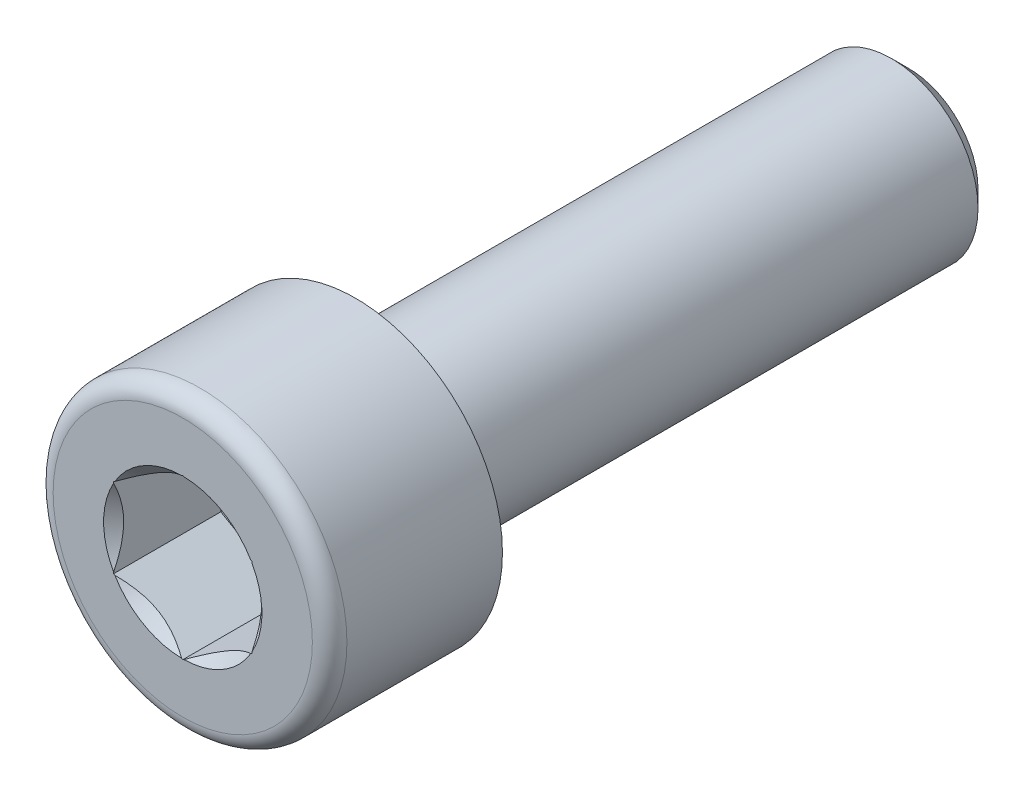
ISO-10303-21;
HEADER;
FILE_DESCRIPTION(('STEP AP214'),'2;1');
FILE_NAME('part.step','',(''),(''),'','','');
FILE_SCHEMA(('AUTOMOTIVE_DESIGN { 1 0 10303 214 1 1 1 1 }'));
ENDSEC;
DATA;
#1=APPLICATION_CONTEXT('core data for automotive mechanical design processes');
#2=APPLICATION_PROTOCOL_DEFINITION('international standard','automotive_design',2000,#1);
#3=PRODUCT_CONTEXT('',#1,'mechanical');
#4=PRODUCT('Part','Part','',(#3));
#5=PRODUCT_RELATED_PRODUCT_CATEGORY('part','',(#4));
#6=PRODUCT_DEFINITION_FORMATION('','',#4);
#7=PRODUCT_DEFINITION_CONTEXT('part definition',#1,'design');
#8=PRODUCT_DEFINITION('design','',#6,#7);
#9=PRODUCT_DEFINITION_SHAPE('','',#8);
#10=(LENGTH_UNIT() NAMED_UNIT(*) SI_UNIT(.MILLI.,.METRE.));
#11=(NAMED_UNIT(*) PLANE_ANGLE_UNIT() SI_UNIT($,.RADIAN.));
#12=(NAMED_UNIT(*) SI_UNIT($,.STERADIAN.) SOLID_ANGLE_UNIT());
#13=UNCERTAINTY_MEASURE_WITH_UNIT(LENGTH_MEASURE(1.E-05),#10,'distance_accuracy_value','');
#14=(GEOMETRIC_REPRESENTATION_CONTEXT(3) GLOBAL_UNCERTAINTY_ASSIGNED_CONTEXT((#13)) GLOBAL_UNIT_ASSIGNED_CONTEXT((#10,
#11,#12)) REPRESENTATION_CONTEXT('',''));
#15=CARTESIAN_POINT('',(0.,0.,0.));
#16=DIRECTION('',(0.,0.,1.));
#17=DIRECTION('',(1.,0.,0.));
#18=AXIS2_PLACEMENT_3D('',#15,#16,#17);
#19=CARTESIAN_POINT('',(0.,-12.,7.9));
#20=DIRECTION('',(0.,0.,-1.));
#21=DIRECTION('',(-1.,0.,0.));
#22=AXIS2_PLACEMENT_3D('',#19,#20,#21);
#23=PLANE('',#22);
#24=DIRECTION('',(0.,1.,0.));
#25=VECTOR('',#24,1.);
#26=CARTESIAN_POINT('',(2.,-12.,7.9));
#27=LINE('',#26,#25);
#28=CARTESIAN_POINT('',(2.,-10.8452994616207,7.9));
#29=VERTEX_POINT('',#28);
#30=CARTESIAN_POINT('',(1.99999999997658,-12.,7.90000000003605));
#31=VERTEX_POINT('',#30);
#32=EDGE_CURVE('E141',#29,#31,#27,.F.);
#33=ORIENTED_EDGE('',*,*,#32,.F.);
#34=DIRECTION('',(0.866025403784449,-0.499999999999982,0.));
#35=VECTOR('',#34,1.);
#36=CARTESIAN_POINT('',(1.,-10.2679491924311,7.9));
#37=LINE('',#36,#35);
#38=CARTESIAN_POINT('',(0.99999999998828,-10.2679491924514,7.90000000003605));
#39=VERTEX_POINT('',#38);
#40=EDGE_CURVE('E164',#39,#29,#37,.T.);
#41=ORIENTED_EDGE('',*,*,#40,.F.);
#42=CARTESIAN_POINT('',(0.,-12.,7.90000000007209));
#43=DIRECTION('',(0.,0.,1.));
#44=DIRECTION('',(1.,0.,0.));
#45=AXIS2_PLACEMENT_3D('',#42,#43,#44);
#46=CIRCLE('',#45,1.99999999995316);
#47=EDGE_CURVE('E171',#39,#31,#46,.F.);
#48=ORIENTED_EDGE('',*,*,#47,.T.);
#49=EDGE_LOOP('',(#33,#41,#48));
#50=FACE_BOUND('',#49,.T.);
#51=ADVANCED_FACE('F16',(#50),#23,.F.);
#52=CARTESIAN_POINT('',(0.,-12.,7.9));
#53=DIRECTION('',(0.,0.,-1.));
#54=DIRECTION('',(-1.,0.,0.));
#55=AXIS2_PLACEMENT_3D('',#52,#53,#54);
#56=PLANE('',#55);
#57=DIRECTION('',(-0.866025403784449,-0.499999999999982,0.));
#58=VECTOR('',#57,1.);
#59=CARTESIAN_POINT('',(2.,-13.1547005383793,7.9));
#60=LINE('',#59,#58);
#61=CARTESIAN_POINT('',(2.,-13.1547005383793,7.9));
#62=VERTEX_POINT('',#61);
#63=CARTESIAN_POINT('',(0.999999999988285,-13.7320508075486,7.90000000003605));
#64=VERTEX_POINT('',#63);
#65=EDGE_CURVE('E576',#62,#64,#60,.T.);
#66=ORIENTED_EDGE('',*,*,#65,.F.);
#67=DIRECTION('',(0.,1.,0.));
#68=VECTOR('',#67,1.);
#69=CARTESIAN_POINT('',(2.,-12.,7.9));
#70=LINE('',#69,#68);
#71=EDGE_CURVE('E581',#31,#62,#70,.F.);
#72=ORIENTED_EDGE('',*,*,#71,.F.);
#73=CARTESIAN_POINT('',(0.,-12.,7.90000000007209));
#74=DIRECTION('',(0.,0.,1.));
#75=DIRECTION('',(1.,0.,0.));
#76=AXIS2_PLACEMENT_3D('',#73,#74,#75);
#77=CIRCLE('',#76,1.99999999995316);
#78=EDGE_CURVE('E178',#31,#64,#77,.F.);
#79=ORIENTED_EDGE('',*,*,#78,.T.);
#80=EDGE_LOOP('',(#66,#72,#79));
#81=FACE_BOUND('',#80,.T.);
#82=ADVANCED_FACE('F592',(#81),#56,.F.);
#83=CARTESIAN_POINT('',(0.,-12.,7.9));
#84=DIRECTION('',(0.,0.,-1.));
#85=DIRECTION('',(-1.,0.,0.));
#86=AXIS2_PLACEMENT_3D('',#83,#84,#85);
#87=PLANE('',#86);
#88=DIRECTION('',(0.866025403784449,0.499999999999982,0.));
#89=VECTOR('',#88,1.);
#90=CARTESIAN_POINT('',(-2.,-10.8452994616207,7.9));
#91=LINE('',#90,#89);
#92=CARTESIAN_POINT('',(-2.,-10.8452994616207,7.9));
#93=VERTEX_POINT('',#92);
#94=CARTESIAN_POINT('',(-0.999999999988285,-10.2679491924514,7.90000000003605));
#95=VERTEX_POINT('',#94);
#96=EDGE_CURVE('E179',#93,#95,#91,.T.);
#97=ORIENTED_EDGE('',*,*,#96,.F.);
#98=DIRECTION('',(0.,1.,0.));
#99=VECTOR('',#98,1.);
#100=CARTESIAN_POINT('',(-2.,-12.,7.9));
#101=LINE('',#100,#99);
#102=CARTESIAN_POINT('',(-1.99999999997658,-12.,7.90000000003605));
#103=VERTEX_POINT('',#102);
#104=EDGE_CURVE('E183',#103,#93,#101,.T.);
#105=ORIENTED_EDGE('',*,*,#104,.F.);
#106=CARTESIAN_POINT('',(0.,-12.,7.90000000007209));
#107=DIRECTION('',(0.,0.,1.));
#108=DIRECTION('',(1.,0.,0.));
#109=AXIS2_PLACEMENT_3D('',#106,#107,#108);
#110=CIRCLE('',#109,1.99999999995316);
#111=EDGE_CURVE('E157',#103,#95,#110,.F.);
#112=ORIENTED_EDGE('',*,*,#111,.T.);
#113=EDGE_LOOP('',(#97,#105,#112));
#114=FACE_BOUND('',#113,.T.);
#115=ADVANCED_FACE('F736',(#114),#87,.F.);
#116=CARTESIAN_POINT('',(0.,-12.,7.90000000000646));
#117=DIRECTION('',(0.,0.,1.));
#118=DIRECTION('',(1.,0.,0.));
#119=AXIS2_PLACEMENT_3D('',#116,#117,#118);
#120=CONICAL_SURFACE('',#119,1.99999999983947,1.04719755116573);
#121=CARTESIAN_POINT('',(0.,-12.,7.90000000007209));
#122=DIRECTION('',(0.,0.,1.));
#123=DIRECTION('',(1.,0.,0.));
#124=AXIS2_PLACEMENT_3D('',#121,#122,#123);
#125=CIRCLE('',#124,1.99999999995316);
#126=CARTESIAN_POINT('',(-0.999999999988287,-13.7320508075486,7.90000000003605));
#127=VERTEX_POINT('',#126);
#128=EDGE_CURVE('E181',#64,#127,#125,.F.);
#129=ORIENTED_EDGE('',*,*,#128,.F.);
#130=ORIENTED_EDGE('',*,*,#78,.F.);
#131=ORIENTED_EDGE('',*,*,#47,.F.);
#132=CARTESIAN_POINT('',(0.,-12.,7.90000000007209));
#133=DIRECTION('',(0.,0.,1.));
#134=DIRECTION('',(1.,0.,0.));
#135=AXIS2_PLACEMENT_3D('',#132,#133,#134);
#136=CIRCLE('',#135,1.99999999995316);
#137=EDGE_CURVE('E147',#95,#39,#136,.F.);
#138=ORIENTED_EDGE('',*,*,#137,.F.);
#139=ORIENTED_EDGE('',*,*,#111,.F.);
#140=CARTESIAN_POINT('',(0.,-12.,7.90000000007209));
#141=DIRECTION('',(0.,0.,1.));
#142=DIRECTION('',(1.,0.,0.));
#143=AXIS2_PLACEMENT_3D('',#140,#141,#142);
#144=CIRCLE('',#143,1.99999999995316);
#145=EDGE_CURVE('E427',#103,#127,#144,.T.);
#146=ORIENTED_EDGE('',*,*,#145,.T.);
#147=EDGE_LOOP('',(#129,#130,#131,#138,#139,#146));
#148=FACE_BOUND('',#147,.T.);
#149=CARTESIAN_POINT('',(0.,-12.0000000000005,6.74529946167013));
#150=VERTEX_POINT('',#149);
#151=VERTEX_LOOP('',#150);
#152=FACE_BOUND('',#151,.T.);
#153=ADVANCED_FACE('F175',(#148,#152),#120,.F.);
#154=CARTESIAN_POINT('',(0.,-12.,7.9));
#155=DIRECTION('',(0.,0.,-1.));
#156=DIRECTION('',(-1.,0.,0.));
#157=AXIS2_PLACEMENT_3D('',#154,#155,#156);
#158=PLANE('',#157);
#159=DIRECTION('',(0.,1.,0.));
#160=VECTOR('',#159,1.);
#161=CARTESIAN_POINT('',(-2.,-13.1547005383793,7.9));
#162=LINE('',#161,#160);
#163=CARTESIAN_POINT('',(-1.99999999999999,-13.1547005383793,7.9));
#164=VERTEX_POINT('',#163);
#165=EDGE_CURVE('E555',#103,#164,#162,.F.);
#166=ORIENTED_EDGE('',*,*,#165,.T.);
#167=DIRECTION('',(-0.866025403784449,0.499999999999982,0.));
#168=VECTOR('',#167,1.);
#169=CARTESIAN_POINT('',(-1.,-13.7320508075689,7.9));
#170=LINE('',#169,#168);
#171=EDGE_CURVE('E156',#127,#164,#170,.T.);
#172=ORIENTED_EDGE('',*,*,#171,.F.);
#173=ORIENTED_EDGE('',*,*,#145,.F.);
#174=EDGE_LOOP('',(#166,#172,#173));
#175=FACE_BOUND('',#174,.T.);
#176=ADVANCED_FACE('F601',(#175),#158,.F.);
#177=CARTESIAN_POINT('',(-2.,-13.1547005383793,7.9));
#178=DIRECTION('',(-1.,0.,0.));
#179=DIRECTION('',(0.,0.,1.));
#180=AXIS2_PLACEMENT_3D('',#177,#178,#179);
#181=PLANE('',#180);
#182=DIRECTION('',(0.,1.,0.));
#183=VECTOR('',#182,1.);
#184=CARTESIAN_POINT('',(-2.,-13.1547005383793,11.));
#185=LINE('',#184,#183);
#186=CARTESIAN_POINT('',(-1.99999999999998,-13.1547005383793,11.));
#187=VERTEX_POINT('',#186);
#188=CARTESIAN_POINT('',(-2.,-13.1153923076755,11.0000000000121));
#189=VERTEX_POINT('',#188);
#190=EDGE_CURVE('E426',#187,#189,#185,.T.);
#191=ORIENTED_EDGE('',*,*,#190,.F.);
#192=DIRECTION('',(0.,0.,1.));
#193=VECTOR('',#192,1.);
#194=CARTESIAN_POINT('',(-1.99999999999998,-13.1547005383793,7.9));
#195=LINE('',#194,#193);
#196=EDGE_CURVE('E544',#187,#164,#195,.F.);
#197=ORIENTED_EDGE('',*,*,#196,.T.);
#198=ORIENTED_EDGE('',*,*,#165,.F.);
#199=ORIENTED_EDGE('',*,*,#104,.T.);
#200=DIRECTION('',(0.,0.,1.));
#201=VECTOR('',#200,1.);
#202=CARTESIAN_POINT('',(-2.,-10.8452994616207,7.9));
#203=LINE('',#202,#201);
#204=CARTESIAN_POINT('',(-2.,-10.8452994616207,11.));
#205=VERTEX_POINT('',#204);
#206=EDGE_CURVE('E519',#93,#205,#203,.T.);
#207=ORIENTED_EDGE('',*,*,#206,.T.);
#208=DIRECTION('',(0.,1.,0.));
#209=VECTOR('',#208,1.);
#210=CARTESIAN_POINT('',(-2.,-13.1547005383793,11.));
#211=LINE('',#210,#209);
#212=CARTESIAN_POINT('',(-2.,-10.8846076923168,11.0000000000158));
#213=VERTEX_POINT('',#212);
#214=EDGE_CURVE('E558',#213,#205,#211,.T.);
#215=ORIENTED_EDGE('',*,*,#214,.F.);
#216=CARTESIAN_POINT('',(-2.,-13.1153923076661,11.0000000000075));
#217=CARTESIAN_POINT('',(-2.,-13.0387518757268,10.9626981445033));
#218=CARTESIAN_POINT('',(-2.,-12.9608599655105,10.9276654504736));
#219=CARTESIAN_POINT('',(-2.,-12.802128485581,10.8636189988048));
#220=CARTESIAN_POINT('',(-2.,-12.7212742913114,10.8346417974975));
#221=CARTESIAN_POINT('',(-2.,-12.5573995809352,10.784763712111));
#222=CARTESIAN_POINT('',(-2.,-12.4743889232887,10.7638312669518));
#223=CARTESIAN_POINT('',(-2.,-12.3066654533863,10.73171111632));
#224=CARTESIAN_POINT('',(-2.,-12.2219582318571,10.7204955196276));
#225=CARTESIAN_POINT('',(-2.,-12.1141427002297,10.7131239639143));
#226=CARTESIAN_POINT('',(-2.,-12.0913253973917,10.711953788984));
#227=CARTESIAN_POINT('',(-2.,-12.0456731167431,10.7103915974494));
#228=CARTESIAN_POINT('',(-2.,-12.0228381501097,10.7099992599771));
#229=CARTESIAN_POINT('',(-2.,-11.9392967625186,10.7100019669893));
#230=CARTESIAN_POINT('',(-2.,-11.8785710343111,10.7127809606342));
#231=CARTESIAN_POINT('',(-2.,-11.7575935247527,10.7237319807046));
#232=CARTESIAN_POINT('',(-2.,-11.6973421099882,10.7319078297067));
#233=CARTESIAN_POINT('',(-2.,-11.5174279195867,10.7640118546901));
#234=CARTESIAN_POINT('',(-2.,-11.3990735407787,10.7955114745661));
#235=CARTESIAN_POINT('',(-2.,-11.2148777068762,10.8576016114019));
#236=CARTESIAN_POINT('',(-2.,-11.1472693866304,10.8833439083316));
#237=CARTESIAN_POINT('',(-2.,-11.0143847648612,10.938873072445));
#238=CARTESIAN_POINT('',(-2.,-10.9490937287137,10.9686244614789));
#239=CARTESIAN_POINT('',(-2.,-10.8846076923339,11.0000000000075));
#240=B_SPLINE_CURVE_WITH_KNOTS('',3,(#216,#217,#218,#219,#220,#221,#222,#223,#224,#225,#226,
#227,#228,#229,#230,#231,#232,#233,#234,#235,#236,#237,#238,#239),.UNSPECIFIED.,.F.,.F.,(4,2,2,
2,2,2,2,2,2,2,2,4),(0.,0.255872334413266,0.513247357952124,0.769602085043043,1.02521851074913,
1.09375136973442,1.16225595213962,1.34433943588656,1.52655202741286,1.89236369423401,
2.10928491887019,2.32439915819559),.UNSPECIFIED.);
#241=EDGE_CURVE('E421',#189,#213,#240,.T.);
#242=ORIENTED_EDGE('',*,*,#241,.F.);
#243=EDGE_LOOP('',(#191,#197,#198,#199,#207,#215,#242));
#244=FACE_BOUND('',#243,.T.);
#245=ADVANCED_FACE('F411',(#244),#181,.F.);
#246=CARTESIAN_POINT('',(0.,-14.3094010767585,7.9));
#247=DIRECTION('',(-0.5,-0.866025403784439,0.));
#248=DIRECTION('',(0.866025403784439,-0.5,0.));
#249=AXIS2_PLACEMENT_3D('',#246,#247,#248);
#250=PLANE('',#249);
#251=DIRECTION('',(0.,0.,1.));
#252=VECTOR('',#251,1.);
#253=CARTESIAN_POINT('',(0.,-14.3094010767585,7.9));
#254=LINE('',#253,#252);
#255=CARTESIAN_POINT('',(0.,-14.3094010767585,11.));
#256=VERTEX_POINT('',#255);
#257=CARTESIAN_POINT('',(0.,-14.3094010767585,7.9));
#258=VERTEX_POINT('',#257);
#259=EDGE_CURVE('E499',#256,#258,#254,.F.);
#260=ORIENTED_EDGE('',*,*,#259,.T.);
#261=DIRECTION('',(-0.866025403784448,0.499999999999983,0.));
#262=VECTOR('',#261,1.);
#263=CARTESIAN_POINT('',(0.,-14.3094010767585,7.9));
#264=LINE('',#263,#262);
#265=EDGE_CURVE('E531',#258,#127,#264,.T.);
#266=ORIENTED_EDGE('',*,*,#265,.T.);
#267=ORIENTED_EDGE('',*,*,#171,.T.);
#268=ORIENTED_EDGE('',*,*,#196,.F.);
#269=DIRECTION('',(0.866025403784439,-0.5,0.));
#270=VECTOR('',#269,1.);
#271=CARTESIAN_POINT('',(0.,-14.3094010767585,11.));
#272=LINE('',#271,#270);
#273=CARTESIAN_POINT('',(-1.96595807363939,-13.1743546537273,11.0000000000158));
#274=VERTEX_POINT('',#273);
#275=EDGE_CURVE('E420',#274,#187,#272,.F.);
#276=ORIENTED_EDGE('',*,*,#275,.F.);
#277=CARTESIAN_POINT('',(-0.0340419263753788,-14.2897469614019,11.0000000000075));
#278=CARTESIAN_POINT('',(-0.100414487391851,-14.2514267454323,10.9626981445033));
#279=CARTESIAN_POINT('',(-0.167870860388495,-14.2124807903241,10.9276654504736));
#280=CARTESIAN_POINT('',(-0.305336354387733,-14.1331150503594,10.8636189988048));
#281=CARTESIAN_POINT('',(-0.375358140627674,-14.0926879532246,10.8346417974975));
#282=CARTESIAN_POINT('',(-0.517277802851353,-14.0107505980365,10.784763712111));
#283=CARTESIAN_POINT('',(-0.589167141157997,-13.9692452692132,10.7638312669518));
#284=CARTESIAN_POINT('',(-0.734419926904412,-13.885383534262,10.73171111632));
#285=CARTESIAN_POINT('',(-0.80777853263264,-13.8430299234974,10.7204955196276));
#286=CARTESIAN_POINT('',(-0.901149521944497,-13.7891221576837,10.7131239639143));
#287=CARTESIAN_POINT('',(-0.920909885848088,-13.7777135062647,10.711953788984));
#288=CARTESIAN_POINT('',(-0.960445920630417,-13.7548873659405,10.7103915974494));
#289=CARTESIAN_POINT('',(-0.980221581829553,-13.7434698826237,10.7099992599771));
#290=CARTESIAN_POINT('',(-1.05257054575086,-13.7016991888282,10.7100019669893));
#291=CARTESIAN_POINT('',(-1.1051605690418,-13.6713363247245,10.7127809606342));
#292=CARTESIAN_POINT('',(-1.20993016560602,-13.6108475699452,10.7237319807046));
#293=CARTESIAN_POINT('',(-1.26210942140601,-13.580721862563,10.7319078297067));
#294=CARTESIAN_POINT('',(-1.41791968079498,-13.4907647673622,10.76401185469));
#295=CARTESIAN_POINT('',(-1.52041757949188,-13.4315875779582,10.7955114745661));
#296=CARTESIAN_POINT('',(-1.67993585092265,-13.339489661007,10.8576016114019));
#297=CARTESIAN_POINT('',(-1.73848637376273,-13.3056855008841,10.8833439083316));
#298=CARTESIAN_POINT('',(-1.85356783198714,-13.2392431899995,10.938873072445));
#299=CARTESIAN_POINT('',(-1.91011152793026,-13.2065976719258,10.9686244614789));
#300=CARTESIAN_POINT('',(-1.9659580736246,-13.1743546537358,11.0000000000075));
#301=B_SPLINE_CURVE_WITH_KNOTS('',3,(#277,#278,#279,#280,#281,#282,#283,#284,#285,#286,#287,
#288,#289,#290,#291,#292,#293,#294,#295,#296,#297,#298,#299,#300),.UNSPECIFIED.,.F.,.F.,(4,2,2,
2,2,2,2,2,2,2,2,4),(0.,0.255872334413267,0.513247357952123,0.769602085043042,1.02521851074913,
1.09375136973441,1.1622559521396,1.34433943588654,1.52655202741284,1.89236369423399,
2.10928491887017,2.32439915819556),.UNSPECIFIED.);
#302=CARTESIAN_POINT('',(-0.0340419263672522,-14.2897469614066,11.0000000000121));
#303=VERTEX_POINT('',#302);
#304=EDGE_CURVE('E415',#303,#274,#301,.T.);
#305=ORIENTED_EDGE('',*,*,#304,.F.);
#306=DIRECTION('',(0.866025403784439,-0.5,0.));
#307=VECTOR('',#306,1.);
#308=CARTESIAN_POINT('',(0.,-14.3094010767585,11.));
#309=LINE('',#308,#307);
#310=EDGE_CURVE('E534',#256,#303,#309,.F.);
#311=ORIENTED_EDGE('',*,*,#310,.F.);
#312=EDGE_LOOP('',(#260,#266,#267,#268,#276,#305,#311));
#313=FACE_BOUND('',#312,.T.);
#314=ADVANCED_FACE('F406',(#313),#250,.F.);
#315=CARTESIAN_POINT('',(0.,-12.,7.9));
#316=DIRECTION('',(0.,0.,-1.));
#317=DIRECTION('',(-1.,0.,0.));
#318=AXIS2_PLACEMENT_3D('',#315,#316,#317);
#319=PLANE('',#318);
#320=ORIENTED_EDGE('',*,*,#265,.F.);
#321=DIRECTION('',(0.866025403784439,0.5,0.));
#322=VECTOR('',#321,1.);
#323=CARTESIAN_POINT('',(2.,-13.1547005383793,7.9));
#324=LINE('',#323,#322);
#325=EDGE_CURVE('E501',#258,#64,#324,.T.);
#326=ORIENTED_EDGE('',*,*,#325,.T.);
#327=ORIENTED_EDGE('',*,*,#128,.T.);
#328=EDGE_LOOP('',(#320,#326,#327));
#329=FACE_BOUND('',#328,.T.);
#330=ADVANCED_FACE('F403',(#329),#319,.F.);
#331=CARTESIAN_POINT('',(0.,-12.,7.9));
#332=DIRECTION('',(0.,0.,-1.));
#333=DIRECTION('',(-1.,0.,0.));
#334=AXIS2_PLACEMENT_3D('',#331,#332,#333);
#335=PLANE('',#334);
#336=DIRECTION('',(-0.866025403784439,0.5,0.));
#337=VECTOR('',#336,1.);
#338=CARTESIAN_POINT('',(0.,-9.6905989232415,7.9));
#339=LINE('',#338,#337);
#340=CARTESIAN_POINT('',(0.,-9.69059892324149,7.9));
#341=VERTEX_POINT('',#340);
#342=EDGE_CURVE('E150',#39,#341,#339,.T.);
#343=ORIENTED_EDGE('',*,*,#342,.T.);
#344=DIRECTION('',(-0.866025403784439,-0.5,0.));
#345=VECTOR('',#344,1.);
#346=CARTESIAN_POINT('',(-2.,-10.8452994616207,7.9));
#347=LINE('',#346,#345);
#348=EDGE_CURVE('E152',#341,#95,#347,.T.);
#349=ORIENTED_EDGE('',*,*,#348,.T.);
#350=ORIENTED_EDGE('',*,*,#137,.T.);
#351=EDGE_LOOP('',(#343,#349,#350));
#352=FACE_BOUND('',#351,.T.);
#353=ADVANCED_FACE('F149',(#352),#335,.F.);
#354=CARTESIAN_POINT('',(-2.,-10.8452994616207,7.9));
#355=DIRECTION('',(-0.5,0.866025403784439,0.));
#356=DIRECTION('',(-0.866025403784439,-0.5,0.));
#357=AXIS2_PLACEMENT_3D('',#354,#355,#356);
#358=PLANE('',#357);
#359=ORIENTED_EDGE('',*,*,#206,.F.);
#360=ORIENTED_EDGE('',*,*,#96,.T.);
#361=ORIENTED_EDGE('',*,*,#348,.F.);
#362=DIRECTION('',(0.,0.,1.));
#363=VECTOR('',#362,1.);
#364=CARTESIAN_POINT('',(0.,-9.6905989232415,7.9));
#365=LINE('',#364,#363);
#366=CARTESIAN_POINT('',(0.,-9.69059892324149,11.));
#367=VERTEX_POINT('',#366);
#368=EDGE_CURVE('E167',#341,#367,#365,.T.);
#369=ORIENTED_EDGE('',*,*,#368,.T.);
#370=DIRECTION('',(-0.866025403784439,-0.5,0.));
#371=VECTOR('',#370,1.);
#372=CARTESIAN_POINT('',(-2.,-10.8452994616207,11.));
#373=LINE('',#372,#371);
#374=CARTESIAN_POINT('',(-0.0340419263606712,-9.71025303858952,11.0000000000158));
#375=VERTEX_POINT('',#374);
#376=EDGE_CURVE('E522',#375,#367,#373,.F.);
#377=ORIENTED_EDGE('',*,*,#376,.F.);
#378=CARTESIAN_POINT('',(-1.96595807362461,-10.8256453462641,11.0000000000075));
#379=CARTESIAN_POINT('',(-1.89958551260814,-10.7873251302945,10.9626981445033));
#380=CARTESIAN_POINT('',(-1.8321291396115,-10.7483791751863,10.9276654504736));
#381=CARTESIAN_POINT('',(-1.69466364561226,-10.6690134352216,10.8636189988048));
#382=CARTESIAN_POINT('',(-1.62464185937232,-10.6285863380868,10.8346417974975));
#383=CARTESIAN_POINT('',(-1.48272219714865,-10.5466489828987,10.784763712111));
#384=CARTESIAN_POINT('',(-1.410832858842,-10.5051436540754,10.7638312669519));
#385=CARTESIAN_POINT('',(-1.26558007309559,-10.4212819191242,10.73171111632));
#386=CARTESIAN_POINT('',(-1.19222146736737,-10.3789283083596,10.7204955196276));
#387=CARTESIAN_POINT('',(-1.09885047805551,-10.3250205425459,10.7131239639144));
#388=CARTESIAN_POINT('',(-1.07909011415192,-10.3136118911269,10.7119537889841));
#389=CARTESIAN_POINT('',(-1.03955407936959,-10.2907857508027,10.7103915974495));
#390=CARTESIAN_POINT('',(-1.01977841817045,-10.2793682674859,10.7099992599771));
#391=CARTESIAN_POINT('',(-0.947429454249137,-10.2375975736904,10.7100019669893));
#392=CARTESIAN_POINT('',(-0.894839430958192,-10.2072347095867,10.7127809606343));
#393=CARTESIAN_POINT('',(-0.790069834393975,-10.1467459548074,10.7237319807046));
#394=CARTESIAN_POINT('',(-0.737890578593979,-10.1166202474252,10.7319078297067));
#395=CARTESIAN_POINT('',(-0.582080319205002,-10.0266631522244,10.7640118546901));
#396=CARTESIAN_POINT('',(-0.479582420508099,-9.96748596282041,10.7955114745662));
#397=CARTESIAN_POINT('',(-0.320064149077342,-9.8753880458692,10.857601611402));
#398=CARTESIAN_POINT('',(-0.261513626237266,-9.84158388574629,10.8833439083317));
#399=CARTESIAN_POINT('',(-0.146432168012872,-9.7751415748617,10.938873072445));
#400=CARTESIAN_POINT('',(-0.0898884720697558,-9.74249605678797,10.9686244614789));
#401=CARTESIAN_POINT('',(-0.034041926375422,-9.71025303859803,11.0000000000075));
#402=B_SPLINE_CURVE_WITH_KNOTS('',3,(#378,#379,#380,#381,#382,#383,#384,#385,#386,#387,#388,
#389,#390,#391,#392,#393,#394,#395,#396,#397,#398,#399,#400,#401),.UNSPECIFIED.,.F.,.F.,(4,2,2,
2,2,2,2,2,2,2,2,4),(0.,0.255872334413259,0.513247357952111,0.769602085043022,1.0252185107491,
1.09375136973439,1.16225595213959,1.34433943588652,1.52655202741284,1.892363694234,
2.10928491887015,2.32439915819551),.UNSPECIFIED.);
#403=CARTESIAN_POINT('',(-1.9659580736327,-10.8256453462688,11.0000000000121));
#404=VERTEX_POINT('',#403);
#405=EDGE_CURVE('E384',#404,#375,#402,.T.);
#406=ORIENTED_EDGE('',*,*,#405,.F.);
#407=DIRECTION('',(-0.866025403784439,-0.5,0.));
#408=VECTOR('',#407,1.);
#409=CARTESIAN_POINT('',(-2.,-10.8452994616207,11.));
#410=LINE('',#409,#408);
#411=EDGE_CURVE('E383',#205,#404,#410,.F.);
#412=ORIENTED_EDGE('',*,*,#411,.F.);
#413=EDGE_LOOP('',(#359,#360,#361,#369,#377,#406,#412));
#414=FACE_BOUND('',#413,.T.);
#415=ADVANCED_FACE('F394',(#414),#358,.F.);
#416=CARTESIAN_POINT('',(2.,-13.1547005383793,7.9));
#417=DIRECTION('',(0.5,-0.866025403784439,0.));
#418=DIRECTION('',(0.866025403784439,0.5,0.));
#419=AXIS2_PLACEMENT_3D('',#416,#417,#418);
#420=PLANE('',#419);
#421=DIRECTION('',(0.,0.,-1.));
#422=VECTOR('',#421,1.);
#423=CARTESIAN_POINT('',(2.,-13.1547005383793,7.9));
#424=LINE('',#423,#422);
#425=CARTESIAN_POINT('',(2.,-13.1547005383793,11.));
#426=VERTEX_POINT('',#425);
#427=EDGE_CURVE('E346',#426,#62,#424,.T.);
#428=ORIENTED_EDGE('',*,*,#427,.T.);
#429=ORIENTED_EDGE('',*,*,#65,.T.);
#430=ORIENTED_EDGE('',*,*,#325,.F.);
#431=ORIENTED_EDGE('',*,*,#259,.F.);
#432=DIRECTION('',(0.866025403784439,0.5,0.));
#433=VECTOR('',#432,1.);
#434=CARTESIAN_POINT('',(2.,-13.1547005383793,11.));
#435=LINE('',#434,#433);
#436=CARTESIAN_POINT('',(0.0340419263606669,-14.2897469614105,11.0000000000158));
#437=VERTEX_POINT('',#436);
#438=EDGE_CURVE('E382',#437,#256,#435,.F.);
#439=ORIENTED_EDGE('',*,*,#438,.F.);
#440=CARTESIAN_POINT('',(1.96595807362461,-13.1743546537359,11.0000000000075));
#441=CARTESIAN_POINT('',(1.89958551260814,-13.2126748697055,10.9626981445033));
#442=CARTESIAN_POINT('',(1.8321291396115,-13.2516208248137,10.9276654504736));
#443=CARTESIAN_POINT('',(1.69466364561226,-13.3309865647784,10.8636189988048));
#444=CARTESIAN_POINT('',(1.62464185937232,-13.3714136619132,10.8346417974975));
#445=CARTESIAN_POINT('',(1.48272219714864,-13.4533510171013,10.784763712111));
#446=CARTESIAN_POINT('',(1.410832858842,-13.4948563459246,10.7638312669519));
#447=CARTESIAN_POINT('',(1.26558007309559,-13.5787180808758,10.73171111632));
#448=CARTESIAN_POINT('',(1.19222146736737,-13.6210716916404,10.7204955196276));
#449=CARTESIAN_POINT('',(1.09885047805551,-13.6749794574541,10.7131239639144));
#450=CARTESIAN_POINT('',(1.07909011415192,-13.6863881088731,10.7119537889841));
#451=CARTESIAN_POINT('',(1.03955407936959,-13.7092142491974,10.7103915974495));
#452=CARTESIAN_POINT('',(1.01977841817045,-13.7206317325141,10.7099992599771));
#453=CARTESIAN_POINT('',(0.947429454249137,-13.7624024263096,10.7100019669893));
#454=CARTESIAN_POINT('',(0.894839430958192,-13.7927652904133,10.7127809606343));
#455=CARTESIAN_POINT('',(0.790069834393974,-13.8532540451926,10.7237319807046));
#456=CARTESIAN_POINT('',(0.737890578593978,-13.8833797525748,10.7319078297067));
#457=CARTESIAN_POINT('',(0.582080319205,-13.9733368477756,10.7640118546901));
#458=CARTESIAN_POINT('',(0.479582420508099,-14.0325140371796,10.7955114745662));
#459=CARTESIAN_POINT('',(0.320064149077341,-14.1246119541308,10.857601611402));
#460=CARTESIAN_POINT('',(0.261513626237263,-14.1584161142537,10.8833439083317));
#461=CARTESIAN_POINT('',(0.146432168012867,-14.2248584251383,10.938873072445));
#462=CARTESIAN_POINT('',(0.0898884720697483,-14.257503943212,10.9686244614789));
#463=CARTESIAN_POINT('',(0.0340419263754131,-14.289746961402,11.0000000000075));
#464=B_SPLINE_CURVE_WITH_KNOTS('',3,(#440,#441,#442,#443,#444,#445,#446,#447,#448,#449,#450,
#451,#452,#453,#454,#455,#456,#457,#458,#459,#460,#461,#462,#463),.UNSPECIFIED.,.F.,.F.,(4,2,2,
2,2,2,2,2,2,2,2,4),(0.,0.255872334413261,0.513247357952112,0.769602085043022,1.0252185107491,
1.09375136973439,1.16225595213959,1.34433943588652,1.52655202741284,1.892363694234,
2.10928491887015,2.32439915819552),.UNSPECIFIED.);
#465=CARTESIAN_POINT('',(1.9659580736327,-13.1743546537312,11.0000000000121));
#466=VERTEX_POINT('',#465);
#467=EDGE_CURVE('E376',#466,#437,#464,.T.);
#468=ORIENTED_EDGE('',*,*,#467,.F.);
#469=DIRECTION('',(0.866025403784439,0.5,0.));
#470=VECTOR('',#469,1.);
#471=CARTESIAN_POINT('',(2.,-13.1547005383793,11.));
#472=LINE('',#471,#470);
#473=EDGE_CURVE('E495',#426,#466,#472,.F.);
#474=ORIENTED_EDGE('',*,*,#473,.F.);
#475=EDGE_LOOP('',(#428,#429,#430,#431,#439,#468,#474));
#476=FACE_BOUND('',#475,.T.);
#477=ADVANCED_FACE('F391',(#476),#420,.F.);
#478=CARTESIAN_POINT('',(0.,-9.6905989232415,7.9));
#479=DIRECTION('',(0.5,0.866025403784439,0.));
#480=DIRECTION('',(-0.866025403784439,0.5,0.));
#481=AXIS2_PLACEMENT_3D('',#478,#479,#480);
#482=PLANE('',#481);
#483=ORIENTED_EDGE('',*,*,#368,.F.);
#484=ORIENTED_EDGE('',*,*,#342,.F.);
#485=ORIENTED_EDGE('',*,*,#40,.T.);
#486=DIRECTION('',(0.,0.,-1.));
#487=VECTOR('',#486,1.);
#488=CARTESIAN_POINT('',(2.,-10.8452994616207,7.9));
#489=LINE('',#488,#487);
#490=CARTESIAN_POINT('',(1.99999999999999,-10.8452994616207,11.));
#491=VERTEX_POINT('',#490);
#492=EDGE_CURVE('E342',#29,#491,#489,.F.);
#493=ORIENTED_EDGE('',*,*,#492,.T.);
#494=DIRECTION('',(-0.866025403784439,0.5,0.));
#495=VECTOR('',#494,1.);
#496=CARTESIAN_POINT('',(0.,-9.6905989232415,11.));
#497=LINE('',#496,#495);
#498=CARTESIAN_POINT('',(1.96595807363939,-10.8256453462727,11.0000000000158));
#499=VERTEX_POINT('',#498);
#500=EDGE_CURVE('E168',#499,#491,#497,.F.);
#501=ORIENTED_EDGE('',*,*,#500,.F.);
#502=CARTESIAN_POINT('',(0.0340419263753864,-9.71025303859806,11.0000000000075));
#503=CARTESIAN_POINT('',(0.100414487391857,-9.74857325456773,10.9626981445033));
#504=CARTESIAN_POINT('',(0.167870860388501,-9.78751920967589,10.9276654504736));
#505=CARTESIAN_POINT('',(0.305336354387739,-9.86688494964064,10.8636189988048));
#506=CARTESIAN_POINT('',(0.37535814062768,-9.90731204677541,10.8346417974975));
#507=CARTESIAN_POINT('',(0.517277802851358,-9.98924940196355,10.784763712111));
#508=CARTESIAN_POINT('',(0.589167141158001,-10.0307547307868,10.7638312669518));
#509=CARTESIAN_POINT('',(0.734419926904415,-10.114616465738,10.73171111632));
#510=CARTESIAN_POINT('',(0.807778532632643,-10.1569700765026,10.7204955196276));
#511=CARTESIAN_POINT('',(0.901149521944498,-10.2108778423163,10.7131239639143));
#512=CARTESIAN_POINT('',(0.920909885848088,-10.2222864937353,10.711953788984));
#513=CARTESIAN_POINT('',(0.960445920630417,-10.2451126340596,10.7103915974494));
#514=CARTESIAN_POINT('',(0.980221581829553,-10.2565301173763,10.7099992599771));
#515=CARTESIAN_POINT('',(1.05257054575086,-10.2983008111718,10.7100019669893));
#516=CARTESIAN_POINT('',(1.1051605690418,-10.3286636752755,10.7127809606342));
#517=CARTESIAN_POINT('',(1.20993016560602,-10.3891524300548,10.7237319807046));
#518=CARTESIAN_POINT('',(1.26210942140601,-10.419278137437,10.7319078297067));
#519=CARTESIAN_POINT('',(1.41791968079499,-10.5092352326378,10.76401185469));
#520=CARTESIAN_POINT('',(1.52041757949189,-10.5684124220418,10.7955114745661));
#521=CARTESIAN_POINT('',(1.67993585092265,-10.660510338993,10.8576016114019));
#522=CARTESIAN_POINT('',(1.73848637376273,-10.6943144991159,10.8833439083316));
#523=CARTESIAN_POINT('',(1.85356783198714,-10.7607568100005,10.938873072445));
#524=CARTESIAN_POINT('',(1.91011152793026,-10.7934023280742,10.9686244614789));
#525=CARTESIAN_POINT('',(1.9659580736246,-10.8256453462642,11.0000000000075));
#526=B_SPLINE_CURVE_WITH_KNOTS('',3,(#502,#503,#504,#505,#506,#507,#508,#509,#510,#511,#512,
#513,#514,#515,#516,#517,#518,#519,#520,#521,#522,#523,#524,#525),.UNSPECIFIED.,.F.,.F.,(4,2,2,
2,2,2,2,2,2,2,2,4),(0.,0.255872334413265,0.51324735795212,0.769602085043036,1.02521851074912,
1.0937513697344,1.16225595213959,1.34433943588653,1.52655202741283,1.89236369423399,
2.10928491887016,2.32439915819555),.UNSPECIFIED.);
#527=CARTESIAN_POINT('',(0.0340419263672522,-9.71025303859337,11.0000000000121));
#528=VERTEX_POINT('',#527);
#529=EDGE_CURVE('E355',#528,#499,#526,.T.);
#530=ORIENTED_EDGE('',*,*,#529,.F.);
#531=DIRECTION('',(-0.866025403784439,0.5,0.));
#532=VECTOR('',#531,1.);
#533=CARTESIAN_POINT('',(0.,-9.6905989232415,11.));
#534=LINE('',#533,#532);
#535=EDGE_CURVE('E514',#367,#528,#534,.F.);
#536=ORIENTED_EDGE('',*,*,#535,.F.);
#537=EDGE_LOOP('',(#483,#484,#485,#493,#501,#530,#536));
#538=FACE_BOUND('',#537,.T.);
#539=ADVANCED_FACE('F162',(#538),#482,.F.);
#540=CARTESIAN_POINT('',(2.,-10.8452994616207,7.9));
#541=DIRECTION('',(1.,0.,0.));
#542=DIRECTION('',(0.,0.,-1.));
#543=AXIS2_PLACEMENT_3D('',#540,#541,#542);
#544=PLANE('',#543);
#545=ORIENTED_EDGE('',*,*,#492,.F.);
#546=ORIENTED_EDGE('',*,*,#32,.T.);
#547=ORIENTED_EDGE('',*,*,#71,.T.);
#548=ORIENTED_EDGE('',*,*,#427,.F.);
#549=DIRECTION('',(0.,1.,0.));
#550=VECTOR('',#549,1.);
#551=CARTESIAN_POINT('',(2.,-10.8452994616207,11.));
#552=LINE('',#551,#550);
#553=CARTESIAN_POINT('',(2.,-13.1153923076755,11.0000000000121));
#554=VERTEX_POINT('',#553);
#555=EDGE_CURVE('E510',#554,#426,#552,.F.);
#556=ORIENTED_EDGE('',*,*,#555,.F.);
#557=CARTESIAN_POINT('',(2.,-13.1153923076694,11.0000000000091));
#558=CARTESIAN_POINT('',(2.,-13.0387518757299,10.9626981445047));
#559=CARTESIAN_POINT('',(2.,-12.9608599655133,10.9276654504748));
#560=CARTESIAN_POINT('',(2.,-12.8021284855835,10.8636189988057));
#561=CARTESIAN_POINT('',(2.,-12.7212742913137,10.8346417974983));
#562=CARTESIAN_POINT('',(2.,-12.557399580937,10.7847637121115));
#563=CARTESIAN_POINT('',(2.,-12.4743889232904,10.7638312669522));
#564=CARTESIAN_POINT('',(2.,-12.3066654533875,10.7317111163201));
#565=CARTESIAN_POINT('',(2.,-12.2219582318581,10.7204955196277));
#566=CARTESIAN_POINT('',(2.,-12.1141427002304,10.7131239639144));
#567=CARTESIAN_POINT('',(2.,-12.0913253973922,10.7119537889841));
#568=CARTESIAN_POINT('',(2.,-12.0456731167434,10.7103915974494));
#569=CARTESIAN_POINT('',(2.,-12.0228381501098,10.7099992599771));
#570=CARTESIAN_POINT('',(2.,-11.9392967625186,10.7100019669893));
#571=CARTESIAN_POINT('',(2.,-11.8785710343111,10.7127809606342));
#572=CARTESIAN_POINT('',(2.,-11.7575935247527,10.7237319807046));
#573=CARTESIAN_POINT('',(2.,-11.6973421099882,10.7319078297067));
#574=CARTESIAN_POINT('',(2.,-11.5174279195867,10.7640118546901));
#575=CARTESIAN_POINT('',(2.,-11.3990735407787,10.7955114745661));
#576=CARTESIAN_POINT('',(2.,-11.2148777068757,10.8576016114021));
#577=CARTESIAN_POINT('',(2.,-11.1472693866293,10.8833439083321));
#578=CARTESIAN_POINT('',(2.,-11.014384764859,10.9388730724459));
#579=CARTESIAN_POINT('',(2.,-10.949093728711,10.9686244614801));
#580=CARTESIAN_POINT('',(2.,-10.8846076923306,11.0000000000091));
#581=B_SPLINE_CURVE_WITH_KNOTS('',3,(#557,#558,#559,#560,#561,#562,#563,#564,#565,#566,#567,
#568,#569,#570,#571,#572,#573,#574,#575,#576,#577,#578,#579,#580),.UNSPECIFIED.,.F.,.F.,(4,2,2,
2,2,2,2,2,2,2,2,4),(0.,0.255872334413963,0.513247357953533,0.76960208504517,1.02521851075197,
1.09375136973763,1.1622559521432,1.34433943589013,1.52655202741643,1.89236369423759,
2.10928491887557,2.32439915820274),.UNSPECIFIED.);
#582=CARTESIAN_POINT('',(2.,-10.8846076923152,11.0000000000166));
#583=VERTEX_POINT('',#582);
#584=EDGE_CURVE('E335',#554,#583,#581,.T.);
#585=ORIENTED_EDGE('',*,*,#584,.T.);
#586=DIRECTION('',(0.,1.,0.));
#587=VECTOR('',#586,1.);
#588=CARTESIAN_POINT('',(2.,-15.02,11.));
#589=LINE('',#588,#587);
#590=EDGE_CURVE('E326',#491,#583,#589,.F.);
#591=ORIENTED_EDGE('',*,*,#590,.F.);
#592=EDGE_LOOP('',(#545,#546,#547,#548,#556,#585,#591));
#593=FACE_BOUND('',#592,.T.);
#594=ADVANCED_FACE('F361',(#593),#544,.F.);
#595=CARTESIAN_POINT('',(0.,-12.,10.9999999999104));
#596=DIRECTION('',(0.,0.,1.));
#597=DIRECTION('',(1.,0.,0.));
#598=AXIS2_PLACEMENT_3D('',#595,#596,#597);
#599=CONICAL_SURFACE('',#598,2.2899999999031,0.785398163397448);
#600=CARTESIAN_POINT('',(0.,-12.,11.0000000000241));
#601=DIRECTION('',(0.,0.,1.));
#602=DIRECTION('',(1.,0.,0.));
#603=AXIS2_PLACEMENT_3D('',#600,#601,#602);
#604=CIRCLE('',#603,2.29000000001679);
#605=EDGE_CURVE('E334',#583,#554,#604,.F.);
#606=ORIENTED_EDGE('',*,*,#605,.F.);
#607=ORIENTED_EDGE('',*,*,#584,.F.);
#608=EDGE_LOOP('',(#606,#607));
#609=FACE_BOUND('',#608,.T.);
#610=ADVANCED_FACE('F363',(#609),#599,.F.);
#611=CARTESIAN_POINT('',(0.,-12.,10.9999999999104));
#612=DIRECTION('',(0.,0.,1.));
#613=DIRECTION('',(1.,0.,0.));
#614=AXIS2_PLACEMENT_3D('',#611,#612,#613);
#615=CONICAL_SURFACE('',#614,2.2899999999031,0.785398163397448);
#616=ORIENTED_EDGE('',*,*,#467,.T.);
#617=CARTESIAN_POINT('',(0.,-12.,11.0000000000241));
#618=DIRECTION('',(0.,0.,1.));
#619=DIRECTION('',(1.,0.,0.));
#620=AXIS2_PLACEMENT_3D('',#617,#618,#619);
#621=CIRCLE('',#620,2.29000000001679);
#622=EDGE_CURVE('E340',#466,#437,#621,.F.);
#623=ORIENTED_EDGE('',*,*,#622,.F.);
#624=EDGE_LOOP('',(#616,#623));
#625=FACE_BOUND('',#624,.T.);
#626=ADVANCED_FACE('F367',(#625),#615,.F.);
#627=CARTESIAN_POINT('',(0.,-12.,10.9999999999104));
#628=DIRECTION('',(0.,0.,1.));
#629=DIRECTION('',(1.,0.,0.));
#630=AXIS2_PLACEMENT_3D('',#627,#628,#629);
#631=CONICAL_SURFACE('',#630,2.2899999999031,0.785398163397448);
#632=ORIENTED_EDGE('',*,*,#304,.T.);
#633=CARTESIAN_POINT('',(0.,-12.,11.0000000000241));
#634=DIRECTION('',(0.,0.,1.));
#635=DIRECTION('',(1.,0.,0.));
#636=AXIS2_PLACEMENT_3D('',#633,#634,#635);
#637=CIRCLE('',#636,2.29000000001679);
#638=EDGE_CURVE('E485',#303,#274,#637,.F.);
#639=ORIENTED_EDGE('',*,*,#638,.F.);
#640=EDGE_LOOP('',(#632,#639));
#641=FACE_BOUND('',#640,.T.);
#642=ADVANCED_FACE('F372',(#641),#631,.F.);
#643=CARTESIAN_POINT('',(0.,-12.,10.9999999999104));
#644=DIRECTION('',(0.,0.,1.));
#645=DIRECTION('',(1.,0.,0.));
#646=AXIS2_PLACEMENT_3D('',#643,#644,#645);
#647=CONICAL_SURFACE('',#646,2.2899999999031,0.785398163397448);
#648=CARTESIAN_POINT('',(0.,-12.,11.0000000000241));
#649=DIRECTION('',(0.,0.,1.));
#650=DIRECTION('',(1.,0.,0.));
#651=AXIS2_PLACEMENT_3D('',#648,#649,#650);
#652=CIRCLE('',#651,2.29000000001679);
#653=EDGE_CURVE('E482',#189,#213,#652,.F.);
#654=ORIENTED_EDGE('',*,*,#653,.F.);
#655=ORIENTED_EDGE('',*,*,#241,.T.);
#656=EDGE_LOOP('',(#654,#655));
#657=FACE_BOUND('',#656,.T.);
#658=ADVANCED_FACE('F428',(#657),#647,.F.);
#659=CARTESIAN_POINT('',(0.,-12.,10.9999999999104));
#660=DIRECTION('',(0.,0.,1.));
#661=DIRECTION('',(1.,0.,0.));
#662=AXIS2_PLACEMENT_3D('',#659,#660,#661);
#663=CONICAL_SURFACE('',#662,2.2899999999031,0.785398163397448);
#664=CARTESIAN_POINT('',(0.,-12.,11.0000000000241));
#665=DIRECTION('',(0.,0.,1.));
#666=DIRECTION('',(1.,0.,0.));
#667=AXIS2_PLACEMENT_3D('',#664,#665,#666);
#668=CIRCLE('',#667,2.29000000001679);
#669=EDGE_CURVE('E479',#404,#375,#668,.F.);
#670=ORIENTED_EDGE('',*,*,#669,.F.);
#671=ORIENTED_EDGE('',*,*,#405,.T.);
#672=EDGE_LOOP('',(#670,#671));
#673=FACE_BOUND('',#672,.T.);
#674=ADVANCED_FACE('F431',(#673),#663,.F.);
#675=CARTESIAN_POINT('',(0.,-12.,10.9999999999104));
#676=DIRECTION('',(0.,0.,1.));
#677=DIRECTION('',(1.,0.,0.));
#678=AXIS2_PLACEMENT_3D('',#675,#676,#677);
#679=CONICAL_SURFACE('',#678,2.2899999999031,0.785398163397448);
#680=CARTESIAN_POINT('',(0.,-12.,11.0000000000241));
#681=DIRECTION('',(0.,0.,1.));
#682=DIRECTION('',(1.,0.,0.));
#683=AXIS2_PLACEMENT_3D('',#680,#681,#682);
#684=CIRCLE('',#683,2.29000000001679);
#685=EDGE_CURVE('E476',#528,#499,#684,.F.);
#686=ORIENTED_EDGE('',*,*,#685,.F.);
#687=ORIENTED_EDGE('',*,*,#529,.T.);
#688=EDGE_LOOP('',(#686,#687));
#689=FACE_BOUND('',#688,.T.);
#690=ADVANCED_FACE('F435',(#689),#679,.F.);
#691=CARTESIAN_POINT('',(0.,-15.02,11.));
#692=DIRECTION('',(0.,0.,1.));
#693=DIRECTION('',(1.,0.,0.));
#694=AXIS2_PLACEMENT_3D('',#691,#692,#693);
#695=PLANE('',#694);
#696=ORIENTED_EDGE('',*,*,#535,.T.);
#697=ORIENTED_EDGE('',*,*,#685,.T.);
#698=ORIENTED_EDGE('',*,*,#500,.T.);
#699=ORIENTED_EDGE('',*,*,#590,.T.);
#700=ORIENTED_EDGE('',*,*,#605,.T.);
#701=ORIENTED_EDGE('',*,*,#555,.T.);
#702=ORIENTED_EDGE('',*,*,#473,.T.);
#703=ORIENTED_EDGE('',*,*,#622,.T.);
#704=ORIENTED_EDGE('',*,*,#438,.T.);
#705=ORIENTED_EDGE('',*,*,#310,.T.);
#706=ORIENTED_EDGE('',*,*,#638,.T.);
#707=ORIENTED_EDGE('',*,*,#275,.T.);
#708=ORIENTED_EDGE('',*,*,#190,.T.);
#709=ORIENTED_EDGE('',*,*,#653,.T.);
#710=ORIENTED_EDGE('',*,*,#214,.T.);
#711=ORIENTED_EDGE('',*,*,#411,.T.);
#712=ORIENTED_EDGE('',*,*,#669,.T.);
#713=ORIENTED_EDGE('',*,*,#376,.T.);
#714=EDGE_LOOP('',(#696,#697,#698,#699,#700,#701,#702,#703,#704,#705,#706,#707,#708,#709,#710,
#711,#712,#713));
#715=FACE_BOUND('',#714,.T.);
#716=CARTESIAN_POINT('',(0.,-12.,11.));
#717=DIRECTION('',(0.,0.,-1.));
#718=DIRECTION('',(-1.,0.,0.));
#719=AXIS2_PLACEMENT_3D('',#716,#717,#718);
#720=CIRCLE('',#719,3.75);
#721=CARTESIAN_POINT('',(-3.75,-12.,11.));
#722=VERTEX_POINT('',#721);
#723=CARTESIAN_POINT('',(3.75,-12.,11.));
#724=VERTEX_POINT('',#723);
#725=EDGE_CURVE('E268',#722,#724,#720,.T.);
#726=ORIENTED_EDGE('',*,*,#725,.F.);
#727=CARTESIAN_POINT('',(0.,-12.,11.));
#728=DIRECTION('',(0.,0.,-1.));
#729=DIRECTION('',(0.,-1.,0.));
#730=AXIS2_PLACEMENT_3D('',#727,#728,#729);
#731=CIRCLE('',#730,3.75);
#732=CARTESIAN_POINT('',(0.,-15.75,11.));
#733=VERTEX_POINT('',#732);
#734=EDGE_CURVE('E298',#733,#722,#731,.T.);
#735=ORIENTED_EDGE('',*,*,#734,.F.);
#736=CARTESIAN_POINT('',(0.,-12.,11.));
#737=DIRECTION('',(0.,0.,-1.));
#738=DIRECTION('',(1.,0.,0.));
#739=AXIS2_PLACEMENT_3D('',#736,#737,#738);
#740=CIRCLE('',#739,3.75);
#741=EDGE_CURVE('E308',#724,#733,#740,.T.);
#742=ORIENTED_EDGE('',*,*,#741,.F.);
#743=EDGE_LOOP('',(#726,#735,#742));
#744=FACE_BOUND('',#743,.T.);
#745=ADVANCED_FACE('F278',(#715,#744),#695,.T.);
#746=CARTESIAN_POINT('',(0.,-12.,10.5));
#747=DIRECTION('',(0.,0.,1.));
#748=DIRECTION('',(-1.,0.,0.));
#749=AXIS2_PLACEMENT_3D('',#746,#747,#748);
#750=TOROIDAL_SURFACE('',#749,3.75,0.499999999999999);
#751=ORIENTED_EDGE('',*,*,#734,.T.);
#752=ORIENTED_EDGE('',*,*,#725,.T.);
#753=ORIENTED_EDGE('',*,*,#741,.T.);
#754=EDGE_LOOP('',(#751,#752,#753));
#755=FACE_BOUND('',#754,.T.);
#756=CARTESIAN_POINT('',(0.,-12.,10.5));
#757=DIRECTION('',(0.,0.,-1.));
#758=DIRECTION('',(-1.,0.,0.));
#759=AXIS2_PLACEMENT_3D('',#756,#757,#758);
#760=CIRCLE('',#759,4.25);
#761=CARTESIAN_POINT('',(-4.25,-12.,10.5));
#762=VERTEX_POINT('',#761);
#763=EDGE_CURVE('E259',#762,#762,#760,.T.);
#764=ORIENTED_EDGE('',*,*,#763,.F.);
#765=EDGE_LOOP('',(#764));
#766=FACE_BOUND('',#765,.T.);
#767=ADVANCED_FACE('F273',(#755,#766),#750,.T.);
#768=CARTESIAN_POINT('',(0.,-12.,8.25));
#769=DIRECTION('',(0.,0.,-1.));
#770=DIRECTION('',(-1.,0.,0.));
#771=AXIS2_PLACEMENT_3D('',#768,#769,#770);
#772=CYLINDRICAL_SURFACE('',#771,4.25);
#773=ORIENTED_EDGE('',*,*,#763,.T.);
#774=EDGE_LOOP('',(#773));
#775=FACE_BOUND('',#774,.T.);
#776=CARTESIAN_POINT('',(0.,-12.,6.));
#777=DIRECTION('',(0.,0.,-1.));
#778=DIRECTION('',(-1.,0.,0.));
#779=AXIS2_PLACEMENT_3D('',#776,#777,#778);
#780=CIRCLE('',#779,4.25);
#781=CARTESIAN_POINT('',(-4.25,-12.,6.));
#782=VERTEX_POINT('',#781);
#783=EDGE_CURVE('E267',#782,#782,#780,.T.);
#784=ORIENTED_EDGE('',*,*,#783,.F.);
#785=EDGE_LOOP('',(#784));
#786=FACE_BOUND('',#785,.T.);
#787=ADVANCED_FACE('F277',(#775,#786),#772,.T.);
#788=CARTESIAN_POINT('',(0.,-15.55,6.));
#789=DIRECTION('',(0.,0.,-1.));
#790=DIRECTION('',(-1.,0.,0.));
#791=AXIS2_PLACEMENT_3D('',#788,#789,#790);
#792=PLANE('',#791);
#793=CARTESIAN_POINT('',(0.,-12.,6.));
#794=DIRECTION('',(0.,0.,-1.));
#795=DIRECTION('',(-1.,0.,0.));
#796=AXIS2_PLACEMENT_3D('',#793,#794,#795);
#797=CIRCLE('',#796,2.85);
#798=CARTESIAN_POINT('',(2.85,-12.,6.));
#799=VERTEX_POINT('',#798);
#800=CARTESIAN_POINT('',(-2.85,-12.,6.));
#801=VERTEX_POINT('',#800);
#802=EDGE_CURVE('E190',#799,#801,#797,.F.);
#803=ORIENTED_EDGE('',*,*,#802,.T.);
#804=CARTESIAN_POINT('',(0.,-12.,6.));
#805=DIRECTION('',(0.,0.,-1.));
#806=DIRECTION('',(0.,-1.,0.));
#807=AXIS2_PLACEMENT_3D('',#804,#805,#806);
#808=CIRCLE('',#807,2.85);
#809=CARTESIAN_POINT('',(0.,-14.85,6.));
#810=VERTEX_POINT('',#809);
#811=EDGE_CURVE('E238',#801,#810,#808,.F.);
#812=ORIENTED_EDGE('',*,*,#811,.T.);
#813=CARTESIAN_POINT('',(0.,-12.,6.));
#814=DIRECTION('',(0.,0.,-1.));
#815=DIRECTION('',(1.,0.,0.));
#816=AXIS2_PLACEMENT_3D('',#813,#814,#815);
#817=CIRCLE('',#816,2.85);
#818=EDGE_CURVE('E34',#810,#799,#817,.F.);
#819=ORIENTED_EDGE('',*,*,#818,.T.);
#820=EDGE_LOOP('',(#803,#812,#819));
#821=FACE_BOUND('',#820,.T.);
#822=ORIENTED_EDGE('',*,*,#783,.T.);
#823=EDGE_LOOP('',(#822));
#824=FACE_BOUND('',#823,.T.);
#825=ADVANCED_FACE('F209',(#821,#824),#792,.T.);
#826=CARTESIAN_POINT('',(0.,-12.,5.8));
#827=DIRECTION('',(0.,0.,1.));
#828=DIRECTION('',(-1.,0.,0.));
#829=AXIS2_PLACEMENT_3D('',#826,#827,#828);
#830=TOROIDAL_SURFACE('',#829,2.85,0.199999999999998);
#831=ORIENTED_EDGE('',*,*,#811,.F.);
#832=ORIENTED_EDGE('',*,*,#802,.F.);
#833=ORIENTED_EDGE('',*,*,#818,.F.);
#834=EDGE_LOOP('',(#831,#832,#833));
#835=FACE_BOUND('',#834,.T.);
#836=CARTESIAN_POINT('',(0.,-12.,5.8702246883513));
#837=DIRECTION('',(0.,0.,1.));
#838=DIRECTION('',(0.,-1.,0.));
#839=AXIS2_PLACEMENT_3D('',#836,#837,#838);
#840=CIRCLE('',#839,2.66273416448871);
#841=CARTESIAN_POINT('',(0.,-14.6627341644887,5.8702246883513));
#842=VERTEX_POINT('',#841);
#843=EDGE_CURVE('E19',#842,#842,#840,.F.);
#844=ORIENTED_EDGE('',*,*,#843,.F.);
#845=EDGE_LOOP('',(#844));
#846=FACE_BOUND('',#845,.T.);
#847=ADVANCED_FACE('F197',(#835,#846),#830,.F.);
#848=CARTESIAN_POINT('',(0.,-13.00475,-10.));
#849=DIRECTION('',(0.,0.,-1.));
#850=DIRECTION('',(-1.,0.,0.));
#851=AXIS2_PLACEMENT_3D('',#848,#849,#850);
#852=PLANE('',#851);
#853=CARTESIAN_POINT('',(0.,-12.,-10.0000000000477));
#854=DIRECTION('',(0.,0.,1.));
#855=DIRECTION('',(1.,0.,0.));
#856=AXIS2_PLACEMENT_3D('',#853,#854,#855);
#857=CIRCLE('',#856,2.00950000004286);
#858=CARTESIAN_POINT('',(2.00950000004286,-12.,-10.0000000000477));
#859=VERTEX_POINT('',#858);
#860=EDGE_CURVE('E463',#859,#859,#857,.T.);
#861=ORIENTED_EDGE('',*,*,#860,.F.);
#862=EDGE_LOOP('',(#861));
#863=FACE_BOUND('',#862,.T.);
#864=ADVANCED_FACE('F208',(#863),#852,.T.);
#865=CARTESIAN_POINT('',(0.,-12.,5.8702246883513));
#866=DIRECTION('',(0.,0.,1.));
#867=DIRECTION('',(1.,0.,0.));
#868=AXIS2_PLACEMENT_3D('',#865,#866,#867);
#869=CONICAL_SURFACE('',#868,2.66273416448871,0.358770670286146);
#870=CARTESIAN_POINT('',(0.,-12.,5.47022468831768));
#871=DIRECTION('',(0.,0.,1.));
#872=DIRECTION('',(-1.,0.,0.));
#873=AXIS2_PLACEMENT_3D('',#870,#871,#872);
#874=CIRCLE('',#873,2.5127341644862);
#875=CARTESIAN_POINT('',(-2.5127341644862,-12.,5.47022468831768));
#876=VERTEX_POINT('',#875);
#877=EDGE_CURVE('E461',#876,#876,#874,.T.);
#878=ORIENTED_EDGE('',*,*,#877,.T.);
#879=EDGE_LOOP('',(#878));
#880=FACE_BOUND('',#879,.T.);
#881=ORIENTED_EDGE('',*,*,#843,.T.);
#882=EDGE_LOOP('',(#881));
#883=FACE_BOUND('',#882,.T.);
#884=ADVANCED_FACE('F659',(#880,#883),#869,.T.);
#885=CARTESIAN_POINT('',(0.,-12.,-9.50950000009243));
#886=DIRECTION('',(0.,0.,1.));
#887=DIRECTION('',(1.,0.,0.));
#888=AXIS2_PLACEMENT_3D('',#885,#886,#887);
#889=CONICAL_SURFACE('',#888,2.49999999994134,0.785398163339504);
#890=ORIENTED_EDGE('',*,*,#860,.T.);
#891=EDGE_LOOP('',(#890));
#892=FACE_BOUND('',#891,.T.);
#893=CARTESIAN_POINT('',(0.,-12.,-9.5095));
#894=DIRECTION('',(0.,0.,-1.));
#895=DIRECTION('',(-1.,0.,0.));
#896=AXIS2_PLACEMENT_3D('',#893,#894,#895);
#897=CIRCLE('',#896,2.5);
#898=CARTESIAN_POINT('',(-2.5,-12.,-9.5095));
#899=VERTEX_POINT('',#898);
#900=EDGE_CURVE('E25',#899,#899,#897,.F.);
#901=ORIENTED_EDGE('',*,*,#900,.F.);
#902=EDGE_LOOP('',(#901));
#903=FACE_BOUND('',#902,.T.);
#904=ADVANCED_FACE('F453',(#892,#903),#889,.T.);
#905=CARTESIAN_POINT('',(0.,-12.,5.39999999999998));
#906=DIRECTION('',(0.,0.,1.));
#907=DIRECTION('',(-1.,0.,0.));
#908=AXIS2_PLACEMENT_3D('',#905,#906,#907);
#909=TOROIDAL_SURFACE('',#908,2.70000000000009,0.200000000000086);
#910=ORIENTED_EDGE('',*,*,#877,.F.);
#911=EDGE_LOOP('',(#910));
#912=FACE_BOUND('',#911,.T.);
#913=CARTESIAN_POINT('',(0.,-12.,5.4));
#914=DIRECTION('',(0.,0.,-1.));
#915=DIRECTION('',(-1.,0.,0.));
#916=AXIS2_PLACEMENT_3D('',#913,#914,#915);
#917=CIRCLE('',#916,2.5);
#918=CARTESIAN_POINT('',(-2.5,-12.,5.4));
#919=VERTEX_POINT('',#918);
#920=EDGE_CURVE('E10',#919,#919,#917,.T.);
#921=ORIENTED_EDGE('',*,*,#920,.F.);
#922=EDGE_LOOP('',(#921));
#923=FACE_BOUND('',#922,.T.);
#924=ADVANCED_FACE('F447',(#912,#923),#909,.F.);
#925=CARTESIAN_POINT('',(0.,-12.,-2.05475));
#926=DIRECTION('',(0.,0.,-1.));
#927=DIRECTION('',(-1.,0.,0.));
#928=AXIS2_PLACEMENT_3D('',#925,#926,#927);
#929=CYLINDRICAL_SURFACE('',#928,2.5);
#930=ORIENTED_EDGE('',*,*,#900,.T.);
#931=EDGE_LOOP('',(#930));
#932=FACE_BOUND('',#931,.T.);
#933=ORIENTED_EDGE('',*,*,#920,.T.);
#934=EDGE_LOOP('',(#933));
#935=FACE_BOUND('',#934,.T.);
#936=ADVANCED_FACE('F445',(#932,#935),#929,.T.);
#937=CLOSED_SHELL('',(#51,#82,#115,#153,#176,#245,#314,#330,#353,#415,#477,#539,#594,#610,#626,
#642,#658,#674,#690,#745,#767,#787,#825,#847,#864,#884,#904,#924,#936));
#938=MANIFOLD_SOLID_BREP('B1',#937);
#939=ADVANCED_BREP_SHAPE_REPRESENTATION('',(#18,#938),#14);
#940=SHAPE_DEFINITION_REPRESENTATION(#9,#939);
ENDSEC;
END-ISO-10303-21;
